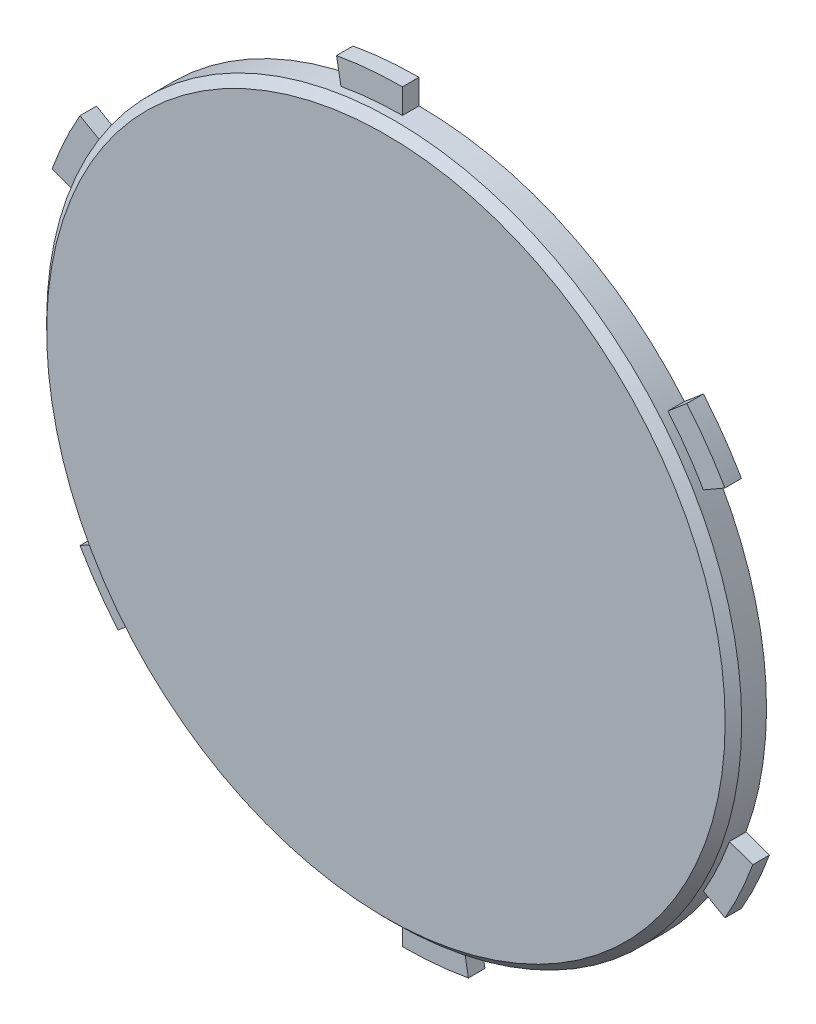
ISO-10303-21;
HEADER;
FILE_DESCRIPTION(('STEP AP214'),'2;1');
FILE_NAME('part.step','',(''),(''),'','','');
FILE_SCHEMA(('AUTOMOTIVE_DESIGN { 1 0 10303 214 1 1 1 1 }'));
ENDSEC;
DATA;
#1=APPLICATION_CONTEXT('core data for automotive mechanical design processes');
#2=APPLICATION_PROTOCOL_DEFINITION('international standard','automotive_design',2000,#1);
#3=PRODUCT_CONTEXT('',#1,'mechanical');
#4=PRODUCT('Part','Part','',(#3));
#5=PRODUCT_RELATED_PRODUCT_CATEGORY('part','',(#4));
#6=PRODUCT_DEFINITION_FORMATION('','',#4);
#7=PRODUCT_DEFINITION_CONTEXT('part definition',#1,'design');
#8=PRODUCT_DEFINITION('design','',#6,#7);
#9=PRODUCT_DEFINITION_SHAPE('','',#8);
#10=(LENGTH_UNIT() NAMED_UNIT(*) SI_UNIT(.MILLI.,.METRE.));
#11=(NAMED_UNIT(*) PLANE_ANGLE_UNIT() SI_UNIT($,.RADIAN.));
#12=(NAMED_UNIT(*) SI_UNIT($,.STERADIAN.) SOLID_ANGLE_UNIT());
#13=UNCERTAINTY_MEASURE_WITH_UNIT(LENGTH_MEASURE(1.E-05),#10,'distance_accuracy_value','');
#14=(GEOMETRIC_REPRESENTATION_CONTEXT(3) GLOBAL_UNCERTAINTY_ASSIGNED_CONTEXT((#13)) GLOBAL_UNIT_ASSIGNED_CONTEXT((#10,
#11,#12)) REPRESENTATION_CONTEXT('',''));
#15=CARTESIAN_POINT('',(0.,0.,0.));
#16=DIRECTION('',(0.,0.,1.));
#17=DIRECTION('',(1.,0.,0.));
#18=AXIS2_PLACEMENT_3D('',#15,#16,#17);
#19=CARTESIAN_POINT('',(0.,0.,2.));
#20=DIRECTION('',(0.,0.,-1.));
#21=DIRECTION('',(-1.,0.,0.));
#22=AXIS2_PLACEMENT_3D('',#19,#20,#21);
#23=CYLINDRICAL_SURFACE('',#22,21.);
#24=CARTESIAN_POINT('',(0.,0.,1.49999999999998));
#25=DIRECTION('',(0.,0.,1.));
#26=DIRECTION('',(1.,0.,0.));
#27=AXIS2_PLACEMENT_3D('',#24,#25,#26);
#28=CIRCLE('',#27,21.);
#29=CARTESIAN_POINT('',(21.,0.,1.49999999999998));
#30=VERTEX_POINT('',#29);
#31=EDGE_CURVE('E11',#30,#30,#28,.F.);
#32=ORIENTED_EDGE('',*,*,#31,.T.);
#33=EDGE_LOOP('',(#32));
#34=FACE_BOUND('',#33,.T.);
#35=CARTESIAN_POINT('',(0.,0.,1.));
#36=DIRECTION('',(0.,0.,1.));
#37=DIRECTION('',(-1.,0.,0.));
#38=AXIS2_PLACEMENT_3D('',#35,#36,#37);
#39=CIRCLE('',#38,21.);
#40=CARTESIAN_POINT('',(18.1865334794731,10.5000000000002,1.));
#41=VERTEX_POINT('',#40);
#42=CARTESIAN_POINT('',(16.0398637891256,13.5544372670465,1.));
#43=VERTEX_POINT('',#42);
#44=EDGE_CURVE('E56',#41,#43,#39,.T.);
#45=ORIENTED_EDGE('',*,*,#44,.T.);
#46=DIRECTION('',(0.,0.,-1.));
#47=VECTOR('',#46,1.);
#48=CARTESIAN_POINT('',(16.0398637891256,13.5544372670465,1.));
#49=LINE('',#48,#47);
#50=CARTESIAN_POINT('',(16.0398637891256,13.5544372670465,0.));
#51=VERTEX_POINT('',#50);
#52=EDGE_CURVE('E230',#43,#51,#49,.T.);
#53=ORIENTED_EDGE('',*,*,#52,.T.);
#54=CARTESIAN_POINT('',(0.,0.,0.));
#55=DIRECTION('',(0.,0.,1.));
#56=DIRECTION('',(1.,0.,0.));
#57=AXIS2_PLACEMENT_3D('',#54,#55,#56);
#58=CIRCLE('',#57,21.);
#59=CARTESIAN_POINT('',(0.,21.,0.));
#60=VERTEX_POINT('',#59);
#61=EDGE_CURVE('E385',#51,#60,#58,.T.);
#62=ORIENTED_EDGE('',*,*,#61,.T.);
#63=DIRECTION('',(0.,0.,-1.));
#64=VECTOR('',#63,1.);
#65=CARTESIAN_POINT('',(0.,21.,1.));
#66=LINE('',#65,#64);
#67=CARTESIAN_POINT('',(0.,21.,1.));
#68=VERTEX_POINT('',#67);
#69=EDGE_CURVE('E349',#68,#60,#66,.T.);
#70=ORIENTED_EDGE('',*,*,#69,.F.);
#71=CARTESIAN_POINT('',(0.,0.,1.));
#72=DIRECTION('',(0.,0.,1.));
#73=DIRECTION('',(-1.,0.,0.));
#74=AXIS2_PLACEMENT_3D('',#71,#72,#73);
#75=CIRCLE('',#74,21.);
#76=CARTESIAN_POINT('',(-3.71855511270174,20.6681481481482,1.));
#77=VERTEX_POINT('',#76);
#78=EDGE_CURVE('E330',#68,#77,#75,.T.);
#79=ORIENTED_EDGE('',*,*,#78,.T.);
#80=DIRECTION('',(0.,0.,-1.));
#81=VECTOR('',#80,1.);
#82=CARTESIAN_POINT('',(-3.71855511270174,20.6681481481482,1.));
#83=LINE('',#82,#81);
#84=CARTESIAN_POINT('',(-3.71855511270174,20.6681481481482,0.));
#85=VERTEX_POINT('',#84);
#86=EDGE_CURVE('E346',#77,#85,#83,.T.);
#87=ORIENTED_EDGE('',*,*,#86,.T.);
#88=CARTESIAN_POINT('',(-18.1865334794732,10.5,0.));
#89=VERTEX_POINT('',#88);
#90=EDGE_CURVE('E375',#85,#89,#58,.T.);
#91=ORIENTED_EDGE('',*,*,#90,.T.);
#92=DIRECTION('',(0.,0.,-1.));
#93=VECTOR('',#92,1.);
#94=CARTESIAN_POINT('',(-18.1865334794732,10.5,1.));
#95=LINE('',#94,#93);
#96=CARTESIAN_POINT('',(-18.1865334794732,10.5,1.));
#97=VERTEX_POINT('',#96);
#98=EDGE_CURVE('E379',#97,#89,#95,.T.);
#99=ORIENTED_EDGE('',*,*,#98,.F.);
#100=CARTESIAN_POINT('',(0.,0.,1.));
#101=DIRECTION('',(0.,0.,1.));
#102=DIRECTION('',(-1.,0.,0.));
#103=AXIS2_PLACEMENT_3D('',#100,#101,#102);
#104=CIRCLE('',#103,21.);
#105=CARTESIAN_POINT('',(-19.7584189018275,7.11371088110181,1.));
#106=VERTEX_POINT('',#105);
#107=EDGE_CURVE('E360',#97,#106,#104,.T.);
#108=ORIENTED_EDGE('',*,*,#107,.T.);
#109=DIRECTION('',(0.,0.,-1.));
#110=VECTOR('',#109,1.);
#111=CARTESIAN_POINT('',(-19.7584189018275,7.11371088110181,1.));
#112=LINE('',#111,#110);
#113=CARTESIAN_POINT('',(-19.7584189018275,7.11371088110181,0.));
#114=VERTEX_POINT('',#113);
#115=EDGE_CURVE('E376',#106,#114,#112,.T.);
#116=ORIENTED_EDGE('',*,*,#115,.T.);
#117=CARTESIAN_POINT('',(-18.1865334794732,-10.5000000000001,0.));
#118=VERTEX_POINT('',#117);
#119=EDGE_CURVE('E383',#114,#118,#58,.T.);
#120=ORIENTED_EDGE('',*,*,#119,.T.);
#121=DIRECTION('',(0.,0.,-1.));
#122=VECTOR('',#121,1.);
#123=CARTESIAN_POINT('',(-18.1865334794732,-10.5000000000001,1.));
#124=LINE('',#123,#122);
#125=CARTESIAN_POINT('',(-18.1865334794732,-10.5000000000001,1.));
#126=VERTEX_POINT('',#125);
#127=EDGE_CURVE('E319',#126,#118,#124,.T.);
#128=ORIENTED_EDGE('',*,*,#127,.F.);
#129=CARTESIAN_POINT('',(0.,0.,1.));
#130=DIRECTION('',(0.,0.,1.));
#131=DIRECTION('',(-1.,0.,0.));
#132=AXIS2_PLACEMENT_3D('',#129,#130,#131);
#133=CIRCLE('',#132,21.);
#134=CARTESIAN_POINT('',(-16.0398637891257,-13.5544372670464,1.));
#135=VERTEX_POINT('',#134);
#136=EDGE_CURVE('E300',#126,#135,#133,.T.);
#137=ORIENTED_EDGE('',*,*,#136,.T.);
#138=DIRECTION('',(0.,0.,-1.));
#139=VECTOR('',#138,1.);
#140=CARTESIAN_POINT('',(-16.0398637891257,-13.5544372670464,1.));
#141=LINE('',#140,#139);
#142=CARTESIAN_POINT('',(-16.0398637891257,-13.5544372670464,0.));
#143=VERTEX_POINT('',#142);
#144=EDGE_CURVE('E316',#135,#143,#141,.T.);
#145=ORIENTED_EDGE('',*,*,#144,.T.);
#146=CARTESIAN_POINT('',(1.46642216231412E-13,-21.,0.));
#147=VERTEX_POINT('',#146);
#148=EDGE_CURVE('E384',#143,#147,#58,.T.);
#149=ORIENTED_EDGE('',*,*,#148,.T.);
#150=DIRECTION('',(0.,0.,-1.));
#151=VECTOR('',#150,1.);
#152=CARTESIAN_POINT('',(1.46642216231412E-13,-21.,1.));
#153=LINE('',#152,#151);
#154=CARTESIAN_POINT('',(1.46642216231412E-13,-21.,1.));
#155=VERTEX_POINT('',#154);
#156=EDGE_CURVE('E289',#155,#147,#153,.T.);
#157=ORIENTED_EDGE('',*,*,#156,.F.);
#158=CARTESIAN_POINT('',(0.,0.,1.));
#159=DIRECTION('',(0.,0.,1.));
#160=DIRECTION('',(-1.,0.,0.));
#161=AXIS2_PLACEMENT_3D('',#158,#159,#160);
#162=CIRCLE('',#161,21.);
#163=CARTESIAN_POINT('',(3.71855511270189,-20.6681481481481,1.));
#164=VERTEX_POINT('',#163);
#165=EDGE_CURVE('E270',#155,#164,#162,.T.);
#166=ORIENTED_EDGE('',*,*,#165,.T.);
#167=DIRECTION('',(0.,0.,-1.));
#168=VECTOR('',#167,1.);
#169=CARTESIAN_POINT('',(3.7185551127019,-20.6681481481481,1.));
#170=LINE('',#169,#168);
#171=CARTESIAN_POINT('',(3.7185551127019,-20.6681481481481,0.));
#172=VERTEX_POINT('',#171);
#173=EDGE_CURVE('E286',#164,#172,#170,.T.);
#174=ORIENTED_EDGE('',*,*,#173,.T.);
#175=CARTESIAN_POINT('',(18.1865334794733,-10.4999999999998,0.));
#176=VERTEX_POINT('',#175);
#177=EDGE_CURVE('E501',#172,#176,#58,.T.);
#178=ORIENTED_EDGE('',*,*,#177,.T.);
#179=DIRECTION('',(0.,0.,-1.));
#180=VECTOR('',#179,1.);
#181=CARTESIAN_POINT('',(18.1865334794733,-10.4999999999998,1.));
#182=LINE('',#181,#180);
#183=CARTESIAN_POINT('',(18.1865334794733,-10.4999999999998,1.));
#184=VERTEX_POINT('',#183);
#185=EDGE_CURVE('E259',#184,#176,#182,.T.);
#186=ORIENTED_EDGE('',*,*,#185,.F.);
#187=CARTESIAN_POINT('',(0.,0.,1.));
#188=DIRECTION('',(0.,0.,1.));
#189=DIRECTION('',(-1.,0.,0.));
#190=AXIS2_PLACEMENT_3D('',#187,#188,#189);
#191=CIRCLE('',#190,21.);
#192=CARTESIAN_POINT('',(19.7584189018275,-7.11371088110167,1.));
#193=VERTEX_POINT('',#192);
#194=EDGE_CURVE('E240',#184,#193,#191,.T.);
#195=ORIENTED_EDGE('',*,*,#194,.T.);
#196=DIRECTION('',(0.,0.,-1.));
#197=VECTOR('',#196,1.);
#198=CARTESIAN_POINT('',(19.7584189018275,-7.11371088110167,1.));
#199=LINE('',#198,#197);
#200=CARTESIAN_POINT('',(19.7584189018275,-7.11371088110167,0.));
#201=VERTEX_POINT('',#200);
#202=EDGE_CURVE('E256',#193,#201,#199,.T.);
#203=ORIENTED_EDGE('',*,*,#202,.T.);
#204=CARTESIAN_POINT('',(18.1865334794731,10.5000000000002,0.));
#205=VERTEX_POINT('',#204);
#206=EDGE_CURVE('E500',#201,#205,#58,.T.);
#207=ORIENTED_EDGE('',*,*,#206,.T.);
#208=DIRECTION('',(0.,0.,-1.));
#209=VECTOR('',#208,1.);
#210=CARTESIAN_POINT('',(18.1865334794731,10.5000000000002,1.));
#211=LINE('',#210,#209);
#212=EDGE_CURVE('E52',#41,#205,#211,.T.);
#213=ORIENTED_EDGE('',*,*,#212,.F.);
#214=EDGE_LOOP('',(#45,#53,#62,#70,#79,#87,#91,#99,#108,#116,#120,#128,#137,#145,#149,#157,#166,
#174,#178,#186,#195,#203,#207,#213));
#215=FACE_BOUND('',#214,.T.);
#216=ADVANCED_FACE('F36',(#34,#215),#23,.T.);
#217=CARTESIAN_POINT('',(0.,0.,2.));
#218=DIRECTION('',(0.,0.,1.));
#219=DIRECTION('',(1.,0.,0.));
#220=AXIS2_PLACEMENT_3D('',#217,#218,#219);
#221=PLANE('',#220);
#222=CARTESIAN_POINT('',(0.,0.,2.));
#223=DIRECTION('',(0.,0.,1.));
#224=DIRECTION('',(1.,0.,0.));
#225=AXIS2_PLACEMENT_3D('',#222,#223,#224);
#226=CIRCLE('',#225,20.5);
#227=CARTESIAN_POINT('',(20.5,0.,2.));
#228=VERTEX_POINT('',#227);
#229=EDGE_CURVE('E45',#228,#228,#226,.T.);
#230=ORIENTED_EDGE('',*,*,#229,.T.);
#231=EDGE_LOOP('',(#230));
#232=FACE_BOUND('',#231,.T.);
#233=ADVANCED_FACE('F389',(#232),#221,.T.);
#234=CARTESIAN_POINT('',(0.,0.,0.));
#235=DIRECTION('',(0.,0.,1.));
#236=DIRECTION('',(1.,0.,0.));
#237=AXIS2_PLACEMENT_3D('',#234,#235,#236);
#238=PLANE('',#237);
#239=ORIENTED_EDGE('',*,*,#119,.F.);
#240=DIRECTION('',(-0.940877090563214,0.338748137195325,0.));
#241=VECTOR('',#240,1.);
#242=CARTESIAN_POINT('',(-21.1697345376723,7.62183308689479,0.));
#243=LINE('',#242,#241);
#244=CARTESIAN_POINT('',(-21.1697345376723,7.62183308689479,0.));
#245=VERTEX_POINT('',#244);
#246=EDGE_CURVE('E357',#114,#245,#243,.T.);
#247=ORIENTED_EDGE('',*,*,#246,.T.);
#248=CARTESIAN_POINT('',(0.,0.,0.));
#249=DIRECTION('',(0.,0.,-1.));
#250=DIRECTION('',(-1.,0.,0.));
#251=AXIS2_PLACEMENT_3D('',#248,#249,#250);
#252=CIRCLE('',#251,22.5);
#253=CARTESIAN_POINT('',(-19.4855715851499,11.25,0.));
#254=VERTEX_POINT('',#253);
#255=EDGE_CURVE('E345',#245,#254,#252,.T.);
#256=ORIENTED_EDGE('',*,*,#255,.T.);
#257=DIRECTION('',(0.86602540378444,-0.499999999999998,0.));
#258=VECTOR('',#257,1.);
#259=CARTESIAN_POINT('',(-19.4855715851499,11.25,0.));
#260=LINE('',#259,#258);
#261=EDGE_CURVE('E368',#254,#89,#260,.T.);
#262=ORIENTED_EDGE('',*,*,#261,.T.);
#263=ORIENTED_EDGE('',*,*,#90,.F.);
#264=DIRECTION('',(-0.177074052985797,0.984197530864198,0.));
#265=VECTOR('',#264,1.);
#266=CARTESIAN_POINT('',(-3.98416619218044,22.1444444444444,0.));
#267=LINE('',#266,#265);
#268=CARTESIAN_POINT('',(-3.98416619218044,22.1444444444444,0.));
#269=VERTEX_POINT('',#268);
#270=EDGE_CURVE('E327',#85,#269,#267,.T.);
#271=ORIENTED_EDGE('',*,*,#270,.T.);
#272=CARTESIAN_POINT('',(0.,0.,0.));
#273=DIRECTION('',(0.,0.,-1.));
#274=DIRECTION('',(-1.,0.,0.));
#275=AXIS2_PLACEMENT_3D('',#272,#273,#274);
#276=CIRCLE('',#275,22.5);
#277=CARTESIAN_POINT('',(0.,22.5,0.));
#278=VERTEX_POINT('',#277);
#279=EDGE_CURVE('E315',#269,#278,#276,.T.);
#280=ORIENTED_EDGE('',*,*,#279,.T.);
#281=DIRECTION('',(0.,-1.,0.));
#282=VECTOR('',#281,1.);
#283=CARTESIAN_POINT('',(0.,22.5,0.));
#284=LINE('',#283,#282);
#285=EDGE_CURVE('E338',#278,#60,#284,.T.);
#286=ORIENTED_EDGE('',*,*,#285,.T.);
#287=ORIENTED_EDGE('',*,*,#61,.F.);
#288=DIRECTION('',(0.763803037577409,0.645449393668879,0.));
#289=VECTOR('',#288,1.);
#290=CARTESIAN_POINT('',(17.1855683454917,14.5226113575498,0.));
#291=LINE('',#290,#289);
#292=CARTESIAN_POINT('',(17.1855683454917,14.5226113575498,0.));
#293=VERTEX_POINT('',#292);
#294=EDGE_CURVE('E218',#51,#293,#291,.T.);
#295=ORIENTED_EDGE('',*,*,#294,.T.);
#296=CARTESIAN_POINT('',(0.,0.,0.));
#297=DIRECTION('',(0.,0.,-1.));
#298=DIRECTION('',(-1.,0.,0.));
#299=AXIS2_PLACEMENT_3D('',#296,#297,#298);
#300=CIRCLE('',#299,22.5);
#301=CARTESIAN_POINT('',(19.4855715851497,11.2500000000002,0.));
#302=VERTEX_POINT('',#301);
#303=EDGE_CURVE('E225',#293,#302,#300,.T.);
#304=ORIENTED_EDGE('',*,*,#303,.T.);
#305=DIRECTION('',(-0.866025403784433,-0.50000000000001,0.));
#306=VECTOR('',#305,1.);
#307=CARTESIAN_POINT('',(19.4855715851497,11.2500000000002,0.));
#308=LINE('',#307,#306);
#309=EDGE_CURVE('E202',#302,#205,#308,.T.);
#310=ORIENTED_EDGE('',*,*,#309,.T.);
#311=ORIENTED_EDGE('',*,*,#206,.F.);
#312=DIRECTION('',(0.940877090563215,-0.338748137195319,0.));
#313=VECTOR('',#312,1.);
#314=CARTESIAN_POINT('',(21.1697345376724,-7.62183308689465,0.));
#315=LINE('',#314,#313);
#316=CARTESIAN_POINT('',(21.1697345376724,-7.62183308689465,0.));
#317=VERTEX_POINT('',#316);
#318=EDGE_CURVE('E237',#201,#317,#315,.T.);
#319=ORIENTED_EDGE('',*,*,#318,.T.);
#320=CARTESIAN_POINT('',(0.,0.,0.));
#321=DIRECTION('',(0.,0.,-1.));
#322=DIRECTION('',(-1.,0.,0.));
#323=AXIS2_PLACEMENT_3D('',#320,#321,#322);
#324=CIRCLE('',#323,22.5);
#325=CARTESIAN_POINT('',(19.48557158515,-11.2499999999998,0.));
#326=VERTEX_POINT('',#325);
#327=EDGE_CURVE('E229',#317,#326,#324,.T.);
#328=ORIENTED_EDGE('',*,*,#327,.T.);
#329=DIRECTION('',(-0.866025403784444,0.499999999999991,0.));
#330=VECTOR('',#329,1.);
#331=CARTESIAN_POINT('',(19.48557158515,-11.2499999999998,0.));
#332=LINE('',#331,#330);
#333=EDGE_CURVE('E248',#326,#176,#332,.T.);
#334=ORIENTED_EDGE('',*,*,#333,.T.);
#335=ORIENTED_EDGE('',*,*,#177,.F.);
#336=DIRECTION('',(0.177074052985803,-0.984197530864197,0.));
#337=VECTOR('',#336,1.);
#338=CARTESIAN_POINT('',(3.98416619218059,-22.1444444444444,0.));
#339=LINE('',#338,#337);
#340=CARTESIAN_POINT('',(3.98416619218059,-22.1444444444444,0.));
#341=VERTEX_POINT('',#340);
#342=EDGE_CURVE('E267',#172,#341,#339,.T.);
#343=ORIENTED_EDGE('',*,*,#342,.T.);
#344=CARTESIAN_POINT('',(0.,0.,0.));
#345=DIRECTION('',(0.,0.,-1.));
#346=DIRECTION('',(-1.,0.,0.));
#347=AXIS2_PLACEMENT_3D('',#344,#345,#346);
#348=CIRCLE('',#347,22.5);
#349=CARTESIAN_POINT('',(1.57116660247941E-13,-22.5,0.));
#350=VERTEX_POINT('',#349);
#351=EDGE_CURVE('E255',#341,#350,#348,.T.);
#352=ORIENTED_EDGE('',*,*,#351,.T.);
#353=DIRECTION('',(0.,1.,0.));
#354=VECTOR('',#353,1.);
#355=CARTESIAN_POINT('',(1.57116660247941E-13,-22.5,0.));
#356=LINE('',#355,#354);
#357=EDGE_CURVE('E278',#350,#147,#356,.T.);
#358=ORIENTED_EDGE('',*,*,#357,.T.);
#359=ORIENTED_EDGE('',*,*,#148,.F.);
#360=DIRECTION('',(-0.763803037577414,-0.645449393668873,0.));
#361=VECTOR('',#360,1.);
#362=CARTESIAN_POINT('',(-17.1855683454918,-14.5226113575497,0.));
#363=LINE('',#362,#361);
#364=CARTESIAN_POINT('',(-17.1855683454918,-14.5226113575497,0.));
#365=VERTEX_POINT('',#364);
#366=EDGE_CURVE('E297',#143,#365,#363,.T.);
#367=ORIENTED_EDGE('',*,*,#366,.T.);
#368=CARTESIAN_POINT('',(0.,0.,0.));
#369=DIRECTION('',(0.,0.,-1.));
#370=DIRECTION('',(-1.,0.,0.));
#371=AXIS2_PLACEMENT_3D('',#368,#369,#370);
#372=CIRCLE('',#371,22.5);
#373=CARTESIAN_POINT('',(-19.4855715851498,-11.2500000000001,0.));
#374=VERTEX_POINT('',#373);
#375=EDGE_CURVE('E285',#365,#374,#372,.T.);
#376=ORIENTED_EDGE('',*,*,#375,.T.);
#377=DIRECTION('',(0.866025403784437,0.500000000000003,0.));
#378=VECTOR('',#377,1.);
#379=CARTESIAN_POINT('',(-19.4855715851498,-11.2500000000001,0.));
#380=LINE('',#379,#378);
#381=EDGE_CURVE('E308',#374,#118,#380,.T.);
#382=ORIENTED_EDGE('',*,*,#381,.T.);
#383=EDGE_LOOP('',(#239,#247,#256,#262,#263,#271,#280,#286,#287,#295,#304,#310,#311,#319,#328,
#334,#335,#343,#352,#358,#359,#367,#376,#382));
#384=FACE_BOUND('',#383,.T.);
#385=ADVANCED_FACE('F403',(#384),#238,.F.);
#386=CARTESIAN_POINT('',(0.,0.,1.));
#387=DIRECTION('',(0.,0.,-1.));
#388=DIRECTION('',(-1.,0.,0.));
#389=AXIS2_PLACEMENT_3D('',#386,#387,#388);
#390=CYLINDRICAL_SURFACE('',#389,22.5);
#391=ORIENTED_EDGE('',*,*,#255,.F.);
#392=DIRECTION('',(0.,0.,-1.));
#393=VECTOR('',#392,1.);
#394=CARTESIAN_POINT('',(-21.1697345376723,7.62183308689479,1.));
#395=LINE('',#394,#393);
#396=CARTESIAN_POINT('',(-21.1697345376723,7.62183308689479,1.));
#397=VERTEX_POINT('',#396);
#398=EDGE_CURVE('E373',#397,#245,#395,.T.);
#399=ORIENTED_EDGE('',*,*,#398,.F.);
#400=CARTESIAN_POINT('',(0.,0.,1.));
#401=DIRECTION('',(0.,0.,-1.));
#402=DIRECTION('',(-1.,0.,0.));
#403=AXIS2_PLACEMENT_3D('',#400,#401,#402);
#404=CIRCLE('',#403,22.5);
#405=CARTESIAN_POINT('',(-19.4855715851499,11.25,1.));
#406=VERTEX_POINT('',#405);
#407=EDGE_CURVE('E353',#397,#406,#404,.T.);
#408=ORIENTED_EDGE('',*,*,#407,.T.);
#409=DIRECTION('',(0.,0.,-1.));
#410=VECTOR('',#409,1.);
#411=CARTESIAN_POINT('',(-19.4855715851499,11.25,1.));
#412=LINE('',#411,#410);
#413=EDGE_CURVE('E365',#406,#254,#412,.T.);
#414=ORIENTED_EDGE('',*,*,#413,.T.);
#415=EDGE_LOOP('',(#391,#399,#408,#414));
#416=FACE_BOUND('',#415,.T.);
#417=ADVANCED_FACE('F407',(#416),#390,.T.);
#418=CARTESIAN_POINT('',(-21.1697345376723,7.62183308689479,1.));
#419=DIRECTION('',(-0.338748137195325,-0.940877090563214,0.));
#420=DIRECTION('',(0.940877090563214,-0.338748137195325,0.));
#421=AXIS2_PLACEMENT_3D('',#418,#419,#420);
#422=PLANE('',#421);
#423=ORIENTED_EDGE('',*,*,#246,.F.);
#424=ORIENTED_EDGE('',*,*,#115,.F.);
#425=DIRECTION('',(-0.940877090563214,0.338748137195325,0.));
#426=VECTOR('',#425,1.);
#427=CARTESIAN_POINT('',(-21.1697345376723,7.62183308689479,1.));
#428=LINE('',#427,#426);
#429=EDGE_CURVE('E362',#106,#397,#428,.T.);
#430=ORIENTED_EDGE('',*,*,#429,.T.);
#431=ORIENTED_EDGE('',*,*,#398,.T.);
#432=EDGE_LOOP('',(#423,#424,#430,#431));
#433=FACE_BOUND('',#432,.T.);
#434=ADVANCED_FACE('F412',(#433),#422,.T.);
#435=CARTESIAN_POINT('',(-19.4855715851499,11.25,1.));
#436=DIRECTION('',(0.499999999999998,0.86602540378444,0.));
#437=DIRECTION('',(-0.86602540378444,0.499999999999998,0.));
#438=AXIS2_PLACEMENT_3D('',#435,#436,#437);
#439=PLANE('',#438);
#440=ORIENTED_EDGE('',*,*,#261,.F.);
#441=ORIENTED_EDGE('',*,*,#413,.F.);
#442=DIRECTION('',(0.86602540378444,-0.499999999999998,0.));
#443=VECTOR('',#442,1.);
#444=CARTESIAN_POINT('',(-19.4855715851499,11.25,1.));
#445=LINE('',#444,#443);
#446=EDGE_CURVE('E356',#406,#97,#445,.T.);
#447=ORIENTED_EDGE('',*,*,#446,.T.);
#448=ORIENTED_EDGE('',*,*,#98,.T.);
#449=EDGE_LOOP('',(#440,#441,#447,#448));
#450=FACE_BOUND('',#449,.T.);
#451=ADVANCED_FACE('F414',(#450),#439,.T.);
#452=CARTESIAN_POINT('',(0.,0.,1.));
#453=DIRECTION('',(0.,0.,-1.));
#454=DIRECTION('',(-1.,0.,0.));
#455=AXIS2_PLACEMENT_3D('',#452,#453,#454);
#456=PLANE('',#455);
#457=ORIENTED_EDGE('',*,*,#407,.F.);
#458=ORIENTED_EDGE('',*,*,#429,.F.);
#459=ORIENTED_EDGE('',*,*,#107,.F.);
#460=ORIENTED_EDGE('',*,*,#446,.F.);
#461=EDGE_LOOP('',(#457,#458,#459,#460));
#462=FACE_BOUND('',#461,.T.);
#463=ADVANCED_FACE('F417',(#462),#456,.F.);
#464=CARTESIAN_POINT('',(0.,0.,1.));
#465=DIRECTION('',(0.,0.,-1.));
#466=DIRECTION('',(-1.,0.,0.));
#467=AXIS2_PLACEMENT_3D('',#464,#465,#466);
#468=CYLINDRICAL_SURFACE('',#467,22.5);
#469=ORIENTED_EDGE('',*,*,#279,.F.);
#470=DIRECTION('',(0.,0.,-1.));
#471=VECTOR('',#470,1.);
#472=CARTESIAN_POINT('',(-3.98416619218044,22.1444444444444,1.));
#473=LINE('',#472,#471);
#474=CARTESIAN_POINT('',(-3.98416619218044,22.1444444444444,1.));
#475=VERTEX_POINT('',#474);
#476=EDGE_CURVE('E343',#475,#269,#473,.T.);
#477=ORIENTED_EDGE('',*,*,#476,.F.);
#478=CARTESIAN_POINT('',(0.,0.,1.));
#479=DIRECTION('',(0.,0.,-1.));
#480=DIRECTION('',(-1.,0.,0.));
#481=AXIS2_PLACEMENT_3D('',#478,#479,#480);
#482=CIRCLE('',#481,22.5);
#483=CARTESIAN_POINT('',(0.,22.5,1.));
#484=VERTEX_POINT('',#483);
#485=EDGE_CURVE('E323',#475,#484,#482,.T.);
#486=ORIENTED_EDGE('',*,*,#485,.T.);
#487=DIRECTION('',(0.,0.,-1.));
#488=VECTOR('',#487,1.);
#489=CARTESIAN_POINT('',(0.,22.5,1.));
#490=LINE('',#489,#488);
#491=EDGE_CURVE('E335',#484,#278,#490,.T.);
#492=ORIENTED_EDGE('',*,*,#491,.T.);
#493=EDGE_LOOP('',(#469,#477,#486,#492));
#494=FACE_BOUND('',#493,.T.);
#495=ADVANCED_FACE('F424',(#494),#468,.T.);
#496=CARTESIAN_POINT('',(-3.98416619218044,22.1444444444444,1.));
#497=DIRECTION('',(-0.984197530864198,-0.177074052985797,0.));
#498=DIRECTION('',(0.177074052985797,-0.984197530864198,0.));
#499=AXIS2_PLACEMENT_3D('',#496,#497,#498);
#500=PLANE('',#499);
#501=ORIENTED_EDGE('',*,*,#270,.F.);
#502=ORIENTED_EDGE('',*,*,#86,.F.);
#503=DIRECTION('',(-0.177074052985797,0.984197530864198,0.));
#504=VECTOR('',#503,1.);
#505=CARTESIAN_POINT('',(-3.98416619218044,22.1444444444444,1.));
#506=LINE('',#505,#504);
#507=EDGE_CURVE('E332',#77,#475,#506,.T.);
#508=ORIENTED_EDGE('',*,*,#507,.T.);
#509=ORIENTED_EDGE('',*,*,#476,.T.);
#510=EDGE_LOOP('',(#501,#502,#508,#509));
#511=FACE_BOUND('',#510,.T.);
#512=ADVANCED_FACE('F428',(#511),#500,.T.);
#513=CARTESIAN_POINT('',(0.,22.5,1.));
#514=DIRECTION('',(1.,0.,0.));
#515=DIRECTION('',(0.,0.,-1.));
#516=AXIS2_PLACEMENT_3D('',#513,#514,#515);
#517=PLANE('',#516);
#518=ORIENTED_EDGE('',*,*,#285,.F.);
#519=ORIENTED_EDGE('',*,*,#491,.F.);
#520=DIRECTION('',(0.,-1.,0.));
#521=VECTOR('',#520,1.);
#522=CARTESIAN_POINT('',(0.,22.5,1.));
#523=LINE('',#522,#521);
#524=EDGE_CURVE('E326',#484,#68,#523,.T.);
#525=ORIENTED_EDGE('',*,*,#524,.T.);
#526=ORIENTED_EDGE('',*,*,#69,.T.);
#527=EDGE_LOOP('',(#518,#519,#525,#526));
#528=FACE_BOUND('',#527,.T.);
#529=ADVANCED_FACE('F430',(#528),#517,.T.);
#530=CARTESIAN_POINT('',(0.,0.,1.));
#531=DIRECTION('',(0.,0.,-1.));
#532=DIRECTION('',(-1.,0.,0.));
#533=AXIS2_PLACEMENT_3D('',#530,#531,#532);
#534=PLANE('',#533);
#535=ORIENTED_EDGE('',*,*,#485,.F.);
#536=ORIENTED_EDGE('',*,*,#507,.F.);
#537=ORIENTED_EDGE('',*,*,#78,.F.);
#538=ORIENTED_EDGE('',*,*,#524,.F.);
#539=EDGE_LOOP('',(#535,#536,#537,#538));
#540=FACE_BOUND('',#539,.T.);
#541=ADVANCED_FACE('F433',(#540),#534,.F.);
#542=CARTESIAN_POINT('',(0.,0.,1.));
#543=DIRECTION('',(0.,0.,-1.));
#544=DIRECTION('',(-1.,0.,0.));
#545=AXIS2_PLACEMENT_3D('',#542,#543,#544);
#546=CYLINDRICAL_SURFACE('',#545,22.5);
#547=ORIENTED_EDGE('',*,*,#375,.F.);
#548=DIRECTION('',(0.,0.,-1.));
#549=VECTOR('',#548,1.);
#550=CARTESIAN_POINT('',(-17.1855683454918,-14.5226113575497,1.));
#551=LINE('',#550,#549);
#552=CARTESIAN_POINT('',(-17.1855683454918,-14.5226113575497,1.));
#553=VERTEX_POINT('',#552);
#554=EDGE_CURVE('E313',#553,#365,#551,.T.);
#555=ORIENTED_EDGE('',*,*,#554,.F.);
#556=CARTESIAN_POINT('',(0.,0.,1.));
#557=DIRECTION('',(0.,0.,-1.));
#558=DIRECTION('',(-1.,0.,0.));
#559=AXIS2_PLACEMENT_3D('',#556,#557,#558);
#560=CIRCLE('',#559,22.5);
#561=CARTESIAN_POINT('',(-19.4855715851498,-11.2500000000001,1.));
#562=VERTEX_POINT('',#561);
#563=EDGE_CURVE('E293',#553,#562,#560,.T.);
#564=ORIENTED_EDGE('',*,*,#563,.T.);
#565=DIRECTION('',(0.,0.,-1.));
#566=VECTOR('',#565,1.);
#567=CARTESIAN_POINT('',(-19.4855715851498,-11.2500000000001,1.));
#568=LINE('',#567,#566);
#569=EDGE_CURVE('E305',#562,#374,#568,.T.);
#570=ORIENTED_EDGE('',*,*,#569,.T.);
#571=EDGE_LOOP('',(#547,#555,#564,#570));
#572=FACE_BOUND('',#571,.T.);
#573=ADVANCED_FACE('F440',(#572),#546,.T.);
#574=CARTESIAN_POINT('',(-17.1855683454918,-14.5226113575497,1.));
#575=DIRECTION('',(0.645449393668873,-0.763803037577414,0.));
#576=DIRECTION('',(0.763803037577414,0.645449393668873,0.));
#577=AXIS2_PLACEMENT_3D('',#574,#575,#576);
#578=PLANE('',#577);
#579=ORIENTED_EDGE('',*,*,#366,.F.);
#580=ORIENTED_EDGE('',*,*,#144,.F.);
#581=DIRECTION('',(-0.763803037577414,-0.645449393668873,0.));
#582=VECTOR('',#581,1.);
#583=CARTESIAN_POINT('',(-17.1855683454918,-14.5226113575497,1.));
#584=LINE('',#583,#582);
#585=EDGE_CURVE('E302',#135,#553,#584,.T.);
#586=ORIENTED_EDGE('',*,*,#585,.T.);
#587=ORIENTED_EDGE('',*,*,#554,.T.);
#588=EDGE_LOOP('',(#579,#580,#586,#587));
#589=FACE_BOUND('',#588,.T.);
#590=ADVANCED_FACE('F444',(#589),#578,.T.);
#591=CARTESIAN_POINT('',(-19.4855715851498,-11.2500000000001,1.));
#592=DIRECTION('',(-0.500000000000003,0.866025403784437,0.));
#593=DIRECTION('',(-0.866025403784437,-0.500000000000003,0.));
#594=AXIS2_PLACEMENT_3D('',#591,#592,#593);
#595=PLANE('',#594);
#596=ORIENTED_EDGE('',*,*,#381,.F.);
#597=ORIENTED_EDGE('',*,*,#569,.F.);
#598=DIRECTION('',(0.866025403784437,0.500000000000003,0.));
#599=VECTOR('',#598,1.);
#600=CARTESIAN_POINT('',(-19.4855715851498,-11.2500000000001,1.));
#601=LINE('',#600,#599);
#602=EDGE_CURVE('E296',#562,#126,#601,.T.);
#603=ORIENTED_EDGE('',*,*,#602,.T.);
#604=ORIENTED_EDGE('',*,*,#127,.T.);
#605=EDGE_LOOP('',(#596,#597,#603,#604));
#606=FACE_BOUND('',#605,.T.);
#607=ADVANCED_FACE('F446',(#606),#595,.T.);
#608=CARTESIAN_POINT('',(0.,0.,1.));
#609=DIRECTION('',(0.,0.,-1.));
#610=DIRECTION('',(-1.,0.,0.));
#611=AXIS2_PLACEMENT_3D('',#608,#609,#610);
#612=PLANE('',#611);
#613=ORIENTED_EDGE('',*,*,#563,.F.);
#614=ORIENTED_EDGE('',*,*,#585,.F.);
#615=ORIENTED_EDGE('',*,*,#136,.F.);
#616=ORIENTED_EDGE('',*,*,#602,.F.);
#617=EDGE_LOOP('',(#613,#614,#615,#616));
#618=FACE_BOUND('',#617,.T.);
#619=ADVANCED_FACE('F449',(#618),#612,.F.);
#620=CARTESIAN_POINT('',(0.,0.,1.));
#621=DIRECTION('',(0.,0.,-1.));
#622=DIRECTION('',(-1.,0.,0.));
#623=AXIS2_PLACEMENT_3D('',#620,#621,#622);
#624=CYLINDRICAL_SURFACE('',#623,22.5);
#625=ORIENTED_EDGE('',*,*,#351,.F.);
#626=DIRECTION('',(0.,0.,-1.));
#627=VECTOR('',#626,1.);
#628=CARTESIAN_POINT('',(3.98416619218059,-22.1444444444444,1.));
#629=LINE('',#628,#627);
#630=CARTESIAN_POINT('',(3.98416619218059,-22.1444444444444,1.));
#631=VERTEX_POINT('',#630);
#632=EDGE_CURVE('E283',#631,#341,#629,.T.);
#633=ORIENTED_EDGE('',*,*,#632,.F.);
#634=CARTESIAN_POINT('',(0.,0.,1.));
#635=DIRECTION('',(0.,0.,-1.));
#636=DIRECTION('',(-1.,0.,0.));
#637=AXIS2_PLACEMENT_3D('',#634,#635,#636);
#638=CIRCLE('',#637,22.5);
#639=CARTESIAN_POINT('',(1.57116660247941E-13,-22.5,1.));
#640=VERTEX_POINT('',#639);
#641=EDGE_CURVE('E263',#631,#640,#638,.T.);
#642=ORIENTED_EDGE('',*,*,#641,.T.);
#643=DIRECTION('',(0.,0.,-1.));
#644=VECTOR('',#643,1.);
#645=CARTESIAN_POINT('',(1.57116660247941E-13,-22.5,1.));
#646=LINE('',#645,#644);
#647=EDGE_CURVE('E275',#640,#350,#646,.T.);
#648=ORIENTED_EDGE('',*,*,#647,.T.);
#649=EDGE_LOOP('',(#625,#633,#642,#648));
#650=FACE_BOUND('',#649,.T.);
#651=ADVANCED_FACE('F456',(#650),#624,.T.);
#652=CARTESIAN_POINT('',(3.98416619218059,-22.1444444444444,1.));
#653=DIRECTION('',(0.984197530864197,0.177074052985803,0.));
#654=DIRECTION('',(-0.177074052985803,0.984197530864197,0.));
#655=AXIS2_PLACEMENT_3D('',#652,#653,#654);
#656=PLANE('',#655);
#657=ORIENTED_EDGE('',*,*,#342,.F.);
#658=ORIENTED_EDGE('',*,*,#173,.F.);
#659=DIRECTION('',(0.177074052985803,-0.984197530864197,0.));
#660=VECTOR('',#659,1.);
#661=CARTESIAN_POINT('',(3.98416619218059,-22.1444444444444,1.));
#662=LINE('',#661,#660);
#663=EDGE_CURVE('E272',#164,#631,#662,.T.);
#664=ORIENTED_EDGE('',*,*,#663,.T.);
#665=ORIENTED_EDGE('',*,*,#632,.T.);
#666=EDGE_LOOP('',(#657,#658,#664,#665));
#667=FACE_BOUND('',#666,.T.);
#668=ADVANCED_FACE('F460',(#667),#656,.T.);
#669=CARTESIAN_POINT('',(1.57116660247941E-13,-22.5,1.));
#670=DIRECTION('',(-1.,0.,0.));
#671=DIRECTION('',(0.,-1.,0.));
#672=AXIS2_PLACEMENT_3D('',#669,#670,#671);
#673=PLANE('',#672);
#674=ORIENTED_EDGE('',*,*,#357,.F.);
#675=ORIENTED_EDGE('',*,*,#647,.F.);
#676=DIRECTION('',(0.,1.,0.));
#677=VECTOR('',#676,1.);
#678=CARTESIAN_POINT('',(1.57116660247941E-13,-22.5,1.));
#679=LINE('',#678,#677);
#680=EDGE_CURVE('E266',#640,#155,#679,.T.);
#681=ORIENTED_EDGE('',*,*,#680,.T.);
#682=ORIENTED_EDGE('',*,*,#156,.T.);
#683=EDGE_LOOP('',(#674,#675,#681,#682));
#684=FACE_BOUND('',#683,.T.);
#685=ADVANCED_FACE('F462',(#684),#673,.T.);
#686=CARTESIAN_POINT('',(0.,0.,1.));
#687=DIRECTION('',(0.,0.,-1.));
#688=DIRECTION('',(-1.,0.,0.));
#689=AXIS2_PLACEMENT_3D('',#686,#687,#688);
#690=PLANE('',#689);
#691=ORIENTED_EDGE('',*,*,#641,.F.);
#692=ORIENTED_EDGE('',*,*,#663,.F.);
#693=ORIENTED_EDGE('',*,*,#165,.F.);
#694=ORIENTED_EDGE('',*,*,#680,.F.);
#695=EDGE_LOOP('',(#691,#692,#693,#694));
#696=FACE_BOUND('',#695,.T.);
#697=ADVANCED_FACE('F465',(#696),#690,.F.);
#698=CARTESIAN_POINT('',(0.,0.,1.));
#699=DIRECTION('',(0.,0.,-1.));
#700=DIRECTION('',(-1.,0.,0.));
#701=AXIS2_PLACEMENT_3D('',#698,#699,#700);
#702=CYLINDRICAL_SURFACE('',#701,22.5);
#703=ORIENTED_EDGE('',*,*,#327,.F.);
#704=DIRECTION('',(0.,0.,-1.));
#705=VECTOR('',#704,1.);
#706=CARTESIAN_POINT('',(21.1697345376724,-7.62183308689465,1.));
#707=LINE('',#706,#705);
#708=CARTESIAN_POINT('',(21.1697345376724,-7.62183308689465,1.));
#709=VERTEX_POINT('',#708);
#710=EDGE_CURVE('E253',#709,#317,#707,.T.);
#711=ORIENTED_EDGE('',*,*,#710,.F.);
#712=CARTESIAN_POINT('',(0.,0.,1.));
#713=DIRECTION('',(0.,0.,-1.));
#714=DIRECTION('',(-1.,0.,0.));
#715=AXIS2_PLACEMENT_3D('',#712,#713,#714);
#716=CIRCLE('',#715,22.5);
#717=CARTESIAN_POINT('',(19.48557158515,-11.2499999999998,1.));
#718=VERTEX_POINT('',#717);
#719=EDGE_CURVE('E233',#709,#718,#716,.T.);
#720=ORIENTED_EDGE('',*,*,#719,.T.);
#721=DIRECTION('',(0.,0.,-1.));
#722=VECTOR('',#721,1.);
#723=CARTESIAN_POINT('',(19.48557158515,-11.2499999999998,1.));
#724=LINE('',#723,#722);
#725=EDGE_CURVE('E245',#718,#326,#724,.T.);
#726=ORIENTED_EDGE('',*,*,#725,.T.);
#727=EDGE_LOOP('',(#703,#711,#720,#726));
#728=FACE_BOUND('',#727,.T.);
#729=ADVANCED_FACE('F472',(#728),#702,.T.);
#730=CARTESIAN_POINT('',(21.1697345376724,-7.62183308689465,1.));
#731=DIRECTION('',(0.338748137195319,0.940877090563215,0.));
#732=DIRECTION('',(-0.940877090563216,0.338748137195319,0.));
#733=AXIS2_PLACEMENT_3D('',#730,#731,#732);
#734=PLANE('',#733);
#735=ORIENTED_EDGE('',*,*,#318,.F.);
#736=ORIENTED_EDGE('',*,*,#202,.F.);
#737=DIRECTION('',(0.940877090563215,-0.338748137195319,0.));
#738=VECTOR('',#737,1.);
#739=CARTESIAN_POINT('',(21.1697345376724,-7.62183308689465,1.));
#740=LINE('',#739,#738);
#741=EDGE_CURVE('E242',#193,#709,#740,.T.);
#742=ORIENTED_EDGE('',*,*,#741,.T.);
#743=ORIENTED_EDGE('',*,*,#710,.T.);
#744=EDGE_LOOP('',(#735,#736,#742,#743));
#745=FACE_BOUND('',#744,.T.);
#746=ADVANCED_FACE('F476',(#745),#734,.T.);
#747=CARTESIAN_POINT('',(19.48557158515,-11.2499999999998,1.));
#748=DIRECTION('',(-0.499999999999991,-0.866025403784444,0.));
#749=DIRECTION('',(0.866025403784444,-0.499999999999991,0.));
#750=AXIS2_PLACEMENT_3D('',#747,#748,#749);
#751=PLANE('',#750);
#752=ORIENTED_EDGE('',*,*,#333,.F.);
#753=ORIENTED_EDGE('',*,*,#725,.F.);
#754=DIRECTION('',(-0.866025403784444,0.499999999999991,0.));
#755=VECTOR('',#754,1.);
#756=CARTESIAN_POINT('',(19.48557158515,-11.2499999999998,1.));
#757=LINE('',#756,#755);
#758=EDGE_CURVE('E236',#718,#184,#757,.T.);
#759=ORIENTED_EDGE('',*,*,#758,.T.);
#760=ORIENTED_EDGE('',*,*,#185,.T.);
#761=EDGE_LOOP('',(#752,#753,#759,#760));
#762=FACE_BOUND('',#761,.T.);
#763=ADVANCED_FACE('F478',(#762),#751,.T.);
#764=CARTESIAN_POINT('',(0.,0.,1.));
#765=DIRECTION('',(0.,0.,-1.));
#766=DIRECTION('',(-1.,0.,0.));
#767=AXIS2_PLACEMENT_3D('',#764,#765,#766);
#768=PLANE('',#767);
#769=ORIENTED_EDGE('',*,*,#719,.F.);
#770=ORIENTED_EDGE('',*,*,#741,.F.);
#771=ORIENTED_EDGE('',*,*,#194,.F.);
#772=ORIENTED_EDGE('',*,*,#758,.F.);
#773=EDGE_LOOP('',(#769,#770,#771,#772));
#774=FACE_BOUND('',#773,.T.);
#775=ADVANCED_FACE('F481',(#774),#768,.F.);
#776=CARTESIAN_POINT('',(0.,0.,1.));
#777=DIRECTION('',(0.,0.,-1.));
#778=DIRECTION('',(-1.,0.,0.));
#779=AXIS2_PLACEMENT_3D('',#776,#777,#778);
#780=CYLINDRICAL_SURFACE('',#779,22.5);
#781=ORIENTED_EDGE('',*,*,#303,.F.);
#782=DIRECTION('',(0.,0.,-1.));
#783=VECTOR('',#782,1.);
#784=CARTESIAN_POINT('',(17.1855683454917,14.5226113575498,1.));
#785=LINE('',#784,#783);
#786=CARTESIAN_POINT('',(17.1855683454917,14.5226113575498,1.));
#787=VERTEX_POINT('',#786);
#788=EDGE_CURVE('E217',#787,#293,#785,.T.);
#789=ORIENTED_EDGE('',*,*,#788,.F.);
#790=CARTESIAN_POINT('',(0.,0.,1.));
#791=DIRECTION('',(0.,0.,-1.));
#792=DIRECTION('',(-1.,0.,0.));
#793=AXIS2_PLACEMENT_3D('',#790,#791,#792);
#794=CIRCLE('',#793,22.5);
#795=CARTESIAN_POINT('',(19.4855715851497,11.2500000000002,1.));
#796=VERTEX_POINT('',#795);
#797=EDGE_CURVE('E213',#787,#796,#794,.T.);
#798=ORIENTED_EDGE('',*,*,#797,.T.);
#799=DIRECTION('',(0.,0.,-1.));
#800=VECTOR('',#799,1.);
#801=CARTESIAN_POINT('',(19.4855715851497,11.2500000000002,1.));
#802=LINE('',#801,#800);
#803=EDGE_CURVE('E197',#796,#302,#802,.T.);
#804=ORIENTED_EDGE('',*,*,#803,.T.);
#805=EDGE_LOOP('',(#781,#789,#798,#804));
#806=FACE_BOUND('',#805,.T.);
#807=ADVANCED_FACE('F216',(#806),#780,.T.);
#808=CARTESIAN_POINT('',(17.1855683454917,14.5226113575498,1.));
#809=DIRECTION('',(-0.645449393668879,0.763803037577409,0.));
#810=DIRECTION('',(-0.763803037577409,-0.645449393668879,0.));
#811=AXIS2_PLACEMENT_3D('',#808,#809,#810);
#812=PLANE('',#811);
#813=ORIENTED_EDGE('',*,*,#294,.F.);
#814=ORIENTED_EDGE('',*,*,#52,.F.);
#815=DIRECTION('',(0.763803037577409,0.645449393668879,0.));
#816=VECTOR('',#815,1.);
#817=CARTESIAN_POINT('',(17.1855683454917,14.5226113575498,1.));
#818=LINE('',#817,#816);
#819=EDGE_CURVE('E207',#43,#787,#818,.T.);
#820=ORIENTED_EDGE('',*,*,#819,.T.);
#821=ORIENTED_EDGE('',*,*,#788,.T.);
#822=EDGE_LOOP('',(#813,#814,#820,#821));
#823=FACE_BOUND('',#822,.T.);
#824=ADVANCED_FACE('F491',(#823),#812,.T.);
#825=CARTESIAN_POINT('',(19.4855715851497,11.2500000000002,1.));
#826=DIRECTION('',(0.50000000000001,-0.866025403784433,0.));
#827=DIRECTION('',(0.866025403784433,0.50000000000001,0.));
#828=AXIS2_PLACEMENT_3D('',#825,#826,#827);
#829=PLANE('',#828);
#830=ORIENTED_EDGE('',*,*,#309,.F.);
#831=ORIENTED_EDGE('',*,*,#803,.F.);
#832=DIRECTION('',(-0.866025403784433,-0.50000000000001,0.));
#833=VECTOR('',#832,1.);
#834=CARTESIAN_POINT('',(19.4855715851497,11.2500000000002,1.));
#835=LINE('',#834,#833);
#836=EDGE_CURVE('E200',#796,#41,#835,.T.);
#837=ORIENTED_EDGE('',*,*,#836,.T.);
#838=ORIENTED_EDGE('',*,*,#212,.T.);
#839=EDGE_LOOP('',(#830,#831,#837,#838));
#840=FACE_BOUND('',#839,.T.);
#841=ADVANCED_FACE('F199',(#840),#829,.T.);
#842=CARTESIAN_POINT('',(0.,0.,1.));
#843=DIRECTION('',(0.,0.,-1.));
#844=DIRECTION('',(-1.,0.,0.));
#845=AXIS2_PLACEMENT_3D('',#842,#843,#844);
#846=PLANE('',#845);
#847=ORIENTED_EDGE('',*,*,#797,.F.);
#848=ORIENTED_EDGE('',*,*,#819,.F.);
#849=ORIENTED_EDGE('',*,*,#44,.F.);
#850=ORIENTED_EDGE('',*,*,#836,.F.);
#851=EDGE_LOOP('',(#847,#848,#849,#850));
#852=FACE_BOUND('',#851,.T.);
#853=ADVANCED_FACE('F211',(#852),#846,.F.);
#854=CARTESIAN_POINT('',(0.,0.,2.));
#855=DIRECTION('',(0.,0.,-1.));
#856=DIRECTION('',(-1.,0.,0.));
#857=AXIS2_PLACEMENT_3D('',#854,#855,#856);
#858=CONICAL_SURFACE('',#857,20.5,0.785398163397441);
#859=ORIENTED_EDGE('',*,*,#31,.F.);
#860=EDGE_LOOP('',(#859));
#861=FACE_BOUND('',#860,.T.);
#862=ORIENTED_EDGE('',*,*,#229,.F.);
#863=EDGE_LOOP('',(#862));
#864=FACE_BOUND('',#863,.T.);
#865=ADVANCED_FACE('F39',(#861,#864),#858,.T.);
#866=CLOSED_SHELL('',(#216,#233,#385,#417,#434,#451,#463,#495,#512,#529,#541,#573,#590,#607,
#619,#651,#668,#685,#697,#729,#746,#763,#775,#807,#824,#841,#853,#865));
#867=MANIFOLD_SOLID_BREP('B2',#866);
#868=ADVANCED_BREP_SHAPE_REPRESENTATION('',(#18,#867),#14);
#869=SHAPE_DEFINITION_REPRESENTATION(#9,#868);
ENDSEC;
END-ISO-10303-21;
